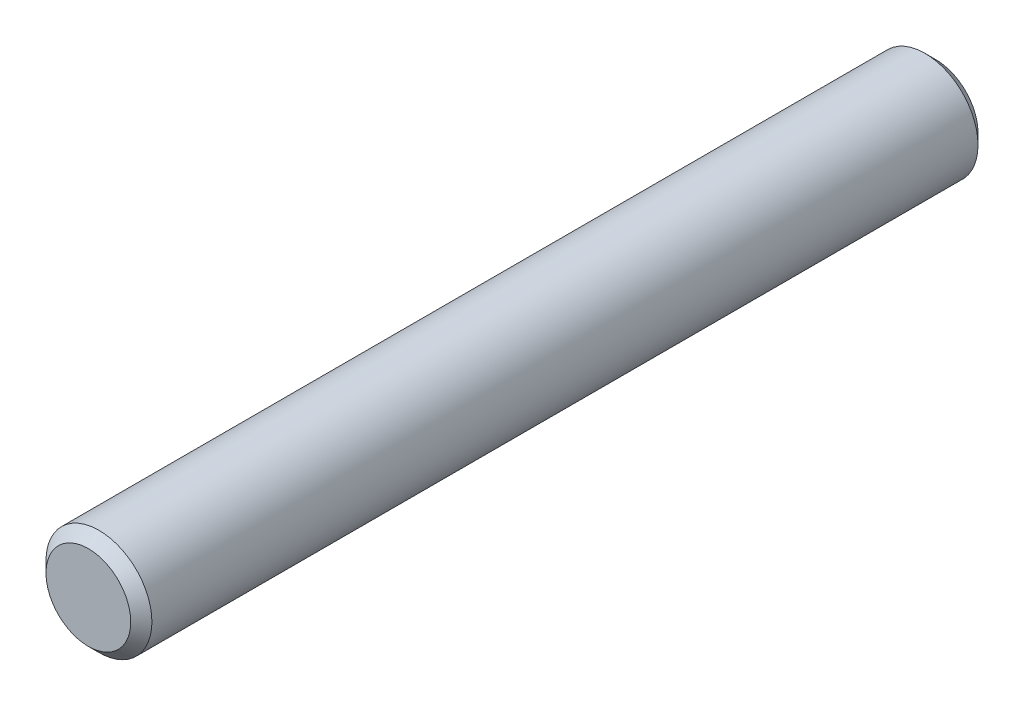
ISO-10303-21;
HEADER;
FILE_DESCRIPTION(('STEP AP214'),'2;1');
FILE_NAME('part.step','',(''),(''),'','','');
FILE_SCHEMA(('AUTOMOTIVE_DESIGN { 1 0 10303 214 1 1 1 1 }'));
ENDSEC;
DATA;
#1=APPLICATION_CONTEXT('core data for automotive mechanical design processes');
#2=APPLICATION_PROTOCOL_DEFINITION('international standard','automotive_design',2000,#1);
#3=PRODUCT_CONTEXT('',#1,'mechanical');
#4=PRODUCT('Part','Part','',(#3));
#5=PRODUCT_RELATED_PRODUCT_CATEGORY('part','',(#4));
#6=PRODUCT_DEFINITION_FORMATION('','',#4);
#7=PRODUCT_DEFINITION_CONTEXT('part definition',#1,'design');
#8=PRODUCT_DEFINITION('design','',#6,#7);
#9=PRODUCT_DEFINITION_SHAPE('','',#8);
#10=(LENGTH_UNIT() NAMED_UNIT(*) SI_UNIT(.MILLI.,.METRE.));
#11=(NAMED_UNIT(*) PLANE_ANGLE_UNIT() SI_UNIT($,.RADIAN.));
#12=(NAMED_UNIT(*) SI_UNIT($,.STERADIAN.) SOLID_ANGLE_UNIT());
#13=UNCERTAINTY_MEASURE_WITH_UNIT(LENGTH_MEASURE(1.E-05),#10,'distance_accuracy_value','');
#14=(GEOMETRIC_REPRESENTATION_CONTEXT(3) GLOBAL_UNCERTAINTY_ASSIGNED_CONTEXT((#13)) GLOBAL_UNIT_ASSIGNED_CONTEXT((#10,
#11,#12)) REPRESENTATION_CONTEXT('',''));
#15=CARTESIAN_POINT('',(0.,0.,0.));
#16=DIRECTION('',(0.,0.,1.));
#17=DIRECTION('',(1.,0.,0.));
#18=AXIS2_PLACEMENT_3D('',#15,#16,#17);
#19=CARTESIAN_POINT('',(0.,0.,12.7));
#20=DIRECTION('',(0.,0.,-1.));
#21=DIRECTION('',(-1.,0.,0.));
#22=AXIS2_PLACEMENT_3D('',#19,#20,#21);
#23=CYLINDRICAL_SURFACE('',#22,1.5875);
#24=CARTESIAN_POINT('',(0.,0.,-12.3825));
#25=DIRECTION('',(0.,0.,1.));
#26=DIRECTION('',(1.,0.,0.));
#27=AXIS2_PLACEMENT_3D('',#24,#25,#26);
#28=CIRCLE('',#27,1.5875);
#29=CARTESIAN_POINT('',(1.5875,0.,-12.3825));
#30=VERTEX_POINT('',#29);
#31=EDGE_CURVE('E49',#30,#30,#28,.T.);
#32=ORIENTED_EDGE('',*,*,#31,.T.);
#33=EDGE_LOOP('',(#32));
#34=FACE_BOUND('',#33,.T.);
#35=CARTESIAN_POINT('',(0.,0.,12.3825));
#36=DIRECTION('',(0.,0.,1.));
#37=DIRECTION('',(1.,0.,0.));
#38=AXIS2_PLACEMENT_3D('',#35,#36,#37);
#39=CIRCLE('',#38,1.5875);
#40=CARTESIAN_POINT('',(1.5875,0.,12.3825));
#41=VERTEX_POINT('',#40);
#42=EDGE_CURVE('E53',#41,#41,#39,.F.);
#43=ORIENTED_EDGE('',*,*,#42,.T.);
#44=EDGE_LOOP('',(#43));
#45=FACE_BOUND('',#44,.T.);
#46=ADVANCED_FACE('F39',(#34,#45),#23,.T.);
#47=CARTESIAN_POINT('',(0.,0.,12.7));
#48=DIRECTION('',(0.,0.,1.));
#49=DIRECTION('',(1.,0.,0.));
#50=AXIS2_PLACEMENT_3D('',#47,#48,#49);
#51=PLANE('',#50);
#52=CARTESIAN_POINT('',(0.,0.,12.7));
#53=DIRECTION('',(0.,0.,1.));
#54=DIRECTION('',(1.,0.,0.));
#55=AXIS2_PLACEMENT_3D('',#52,#53,#54);
#56=CIRCLE('',#55,1.26999999999999);
#57=CARTESIAN_POINT('',(1.26999999999999,0.,12.7));
#58=VERTEX_POINT('',#57);
#59=EDGE_CURVE('E10',#58,#58,#56,.T.);
#60=ORIENTED_EDGE('',*,*,#59,.T.);
#61=EDGE_LOOP('',(#60));
#62=FACE_BOUND('',#61,.T.);
#63=ADVANCED_FACE('F68',(#62),#51,.T.);
#64=CARTESIAN_POINT('',(0.,0.,-12.7));
#65=DIRECTION('',(0.,0.,1.));
#66=DIRECTION('',(1.,0.,0.));
#67=AXIS2_PLACEMENT_3D('',#64,#65,#66);
#68=PLANE('',#67);
#69=CARTESIAN_POINT('',(0.,0.,-12.7));
#70=DIRECTION('',(0.,0.,1.));
#71=DIRECTION('',(1.,0.,0.));
#72=AXIS2_PLACEMENT_3D('',#69,#70,#71);
#73=CIRCLE('',#72,1.27);
#74=CARTESIAN_POINT('',(1.27,0.,-12.7));
#75=VERTEX_POINT('',#74);
#76=EDGE_CURVE('E46',#75,#75,#73,.F.);
#77=ORIENTED_EDGE('',*,*,#76,.T.);
#78=EDGE_LOOP('',(#77));
#79=FACE_BOUND('',#78,.T.);
#80=ADVANCED_FACE('F69',(#79),#68,.F.);
#81=CARTESIAN_POINT('',(0.,0.,-12.3825));
#82=DIRECTION('',(0.,0.,1.));
#83=DIRECTION('',(1.,0.,0.));
#84=AXIS2_PLACEMENT_3D('',#81,#82,#83);
#85=CONICAL_SURFACE('',#84,1.5875,0.78539816339745);
#86=ORIENTED_EDGE('',*,*,#76,.F.);
#87=EDGE_LOOP('',(#86));
#88=FACE_BOUND('',#87,.T.);
#89=ORIENTED_EDGE('',*,*,#31,.F.);
#90=EDGE_LOOP('',(#89));
#91=FACE_BOUND('',#90,.T.);
#92=ADVANCED_FACE('F64',(#88,#91),#85,.T.);
#93=CARTESIAN_POINT('',(0.,0.,12.7));
#94=DIRECTION('',(0.,0.,-1.));
#95=DIRECTION('',(-1.,0.,0.));
#96=AXIS2_PLACEMENT_3D('',#93,#94,#95);
#97=CONICAL_SURFACE('',#96,1.26999999999999,0.78539816339745);
#98=ORIENTED_EDGE('',*,*,#42,.F.);
#99=EDGE_LOOP('',(#98));
#100=FACE_BOUND('',#99,.T.);
#101=ORIENTED_EDGE('',*,*,#59,.F.);
#102=EDGE_LOOP('',(#101));
#103=FACE_BOUND('',#102,.T.);
#104=ADVANCED_FACE('F41',(#100,#103),#97,.T.);
#105=CLOSED_SHELL('',(#46,#63,#80,#92,#104));
#106=MANIFOLD_SOLID_BREP('B2',#105);
#107=ADVANCED_BREP_SHAPE_REPRESENTATION('',(#18,#106),#14);
#108=SHAPE_DEFINITION_REPRESENTATION(#9,#107);
ENDSEC;
END-ISO-10303-21;
